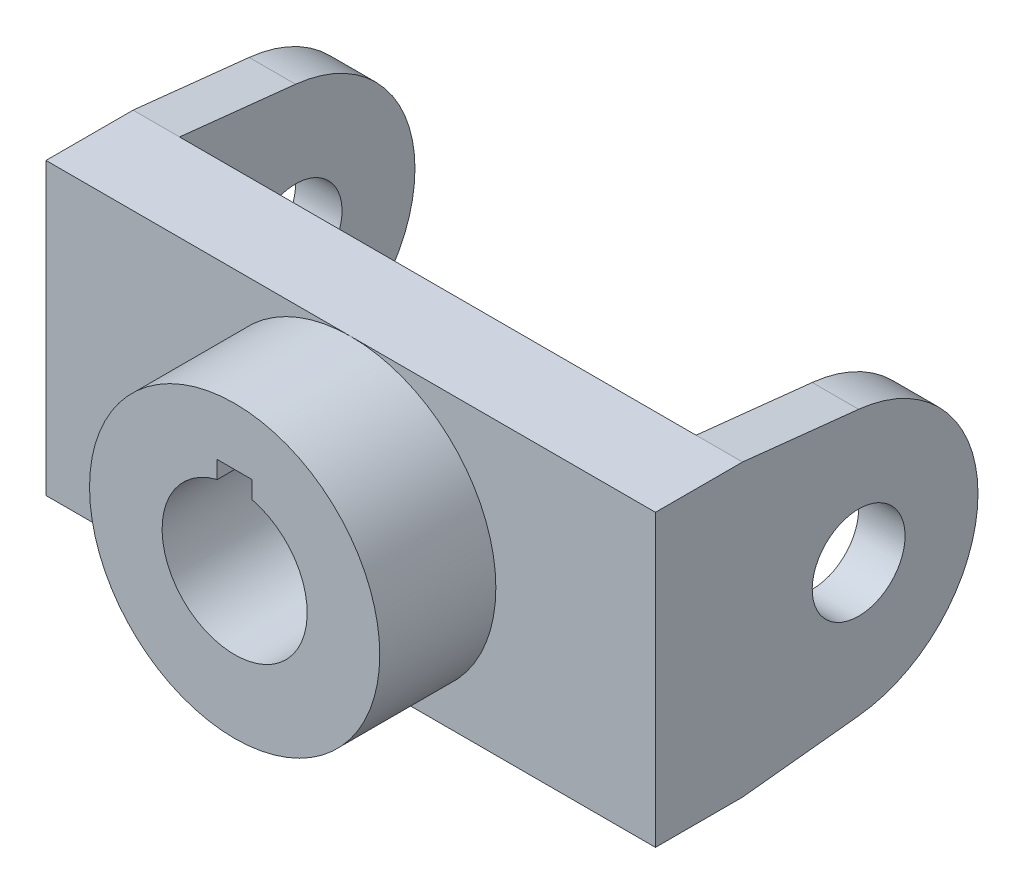
ISO-10303-21;
HEADER;
FILE_DESCRIPTION(('STEP AP214'),'2;1');
FILE_NAME('part.step','',(''),(''),'','','');
FILE_SCHEMA(('AUTOMOTIVE_DESIGN { 1 0 10303 214 1 1 1 1 }'));
ENDSEC;
DATA;
#1=APPLICATION_CONTEXT('core data for automotive mechanical design processes');
#2=APPLICATION_PROTOCOL_DEFINITION('international standard','automotive_design',2000,#1);
#3=PRODUCT_CONTEXT('',#1,'mechanical');
#4=PRODUCT('Part','Part','',(#3));
#5=PRODUCT_RELATED_PRODUCT_CATEGORY('part','',(#4));
#6=PRODUCT_DEFINITION_FORMATION('','',#4);
#7=PRODUCT_DEFINITION_CONTEXT('part definition',#1,'design');
#8=PRODUCT_DEFINITION('design','',#6,#7);
#9=PRODUCT_DEFINITION_SHAPE('','',#8);
#10=(LENGTH_UNIT() NAMED_UNIT(*) SI_UNIT(.MILLI.,.METRE.));
#11=(NAMED_UNIT(*) PLANE_ANGLE_UNIT() SI_UNIT($,.RADIAN.));
#12=(NAMED_UNIT(*) SI_UNIT($,.STERADIAN.) SOLID_ANGLE_UNIT());
#13=UNCERTAINTY_MEASURE_WITH_UNIT(LENGTH_MEASURE(1.E-05),#10,'distance_accuracy_value','');
#14=(GEOMETRIC_REPRESENTATION_CONTEXT(3) GLOBAL_UNCERTAINTY_ASSIGNED_CONTEXT((#13)) GLOBAL_UNIT_ASSIGNED_CONTEXT((#10,
#11,#12)) REPRESENTATION_CONTEXT('',''));
#15=CARTESIAN_POINT('',(0.,0.,0.));
#16=DIRECTION('',(0.,0.,1.));
#17=DIRECTION('',(1.,0.,0.));
#18=AXIS2_PLACEMENT_3D('',#15,#16,#17);
#19=CARTESIAN_POINT('',(0.,0.,15.));
#20=DIRECTION('',(0.,0.,1.));
#21=DIRECTION('',(1.,0.,0.));
#22=AXIS2_PLACEMENT_3D('',#19,#20,#21);
#23=PLANE('',#22);
#24=CARTESIAN_POINT('',(0.,0.,15.));
#25=DIRECTION('',(0.,0.,1.));
#26=DIRECTION('',(1.,0.,0.));
#27=AXIS2_PLACEMENT_3D('',#24,#25,#26);
#28=CIRCLE('',#27,25.);
#29=CARTESIAN_POINT('',(0.,25.,15.));
#30=VERTEX_POINT('',#29);
#31=CARTESIAN_POINT('',(0.,-25.,15.));
#32=VERTEX_POINT('',#31);
#33=EDGE_CURVE('E52',#30,#32,#28,.T.);
#34=ORIENTED_EDGE('',*,*,#33,.F.);
#35=DIRECTION('',(-1.,0.,0.));
#36=VECTOR('',#35,1.);
#37=CARTESIAN_POINT('',(-52.5,25.,15.));
#38=LINE('',#37,#36);
#39=CARTESIAN_POINT('',(-52.5,25.,15.));
#40=VERTEX_POINT('',#39);
#41=EDGE_CURVE('E302',#30,#40,#38,.T.);
#42=ORIENTED_EDGE('',*,*,#41,.T.);
#43=DIRECTION('',(0.,-1.,0.));
#44=VECTOR('',#43,1.);
#45=CARTESIAN_POINT('',(-52.5,25.,15.));
#46=LINE('',#45,#44);
#47=CARTESIAN_POINT('',(-52.5,-25.,15.));
#48=VERTEX_POINT('',#47);
#49=EDGE_CURVE('E307',#40,#48,#46,.T.);
#50=ORIENTED_EDGE('',*,*,#49,.T.);
#51=DIRECTION('',(1.,0.,0.));
#52=VECTOR('',#51,1.);
#53=CARTESIAN_POINT('',(-52.5,-25.,15.));
#54=LINE('',#53,#52);
#55=EDGE_CURVE('E311',#48,#32,#54,.T.);
#56=ORIENTED_EDGE('',*,*,#55,.T.);
#57=EDGE_LOOP('',(#34,#42,#50,#56));
#58=FACE_BOUND('',#57,.T.);
#59=ADVANCED_FACE('F41',(#58),#23,.T.);
#60=CARTESIAN_POINT('',(0.,0.,0.));
#61=DIRECTION('',(0.,0.,1.));
#62=DIRECTION('',(1.,0.,0.));
#63=AXIS2_PLACEMENT_3D('',#60,#61,#62);
#64=PLANE('',#63);
#65=DIRECTION('',(0.,-1.,0.));
#66=VECTOR('',#65,1.);
#67=CARTESIAN_POINT('',(44.5,0.,0.));
#68=LINE('',#67,#66);
#69=CARTESIAN_POINT('',(44.5,25.,0.));
#70=VERTEX_POINT('',#69);
#71=CARTESIAN_POINT('',(44.5,-25.,0.));
#72=VERTEX_POINT('',#71);
#73=EDGE_CURVE('E217',#70,#72,#68,.T.);
#74=ORIENTED_EDGE('',*,*,#73,.T.);
#75=DIRECTION('',(1.,0.,0.));
#76=VECTOR('',#75,1.);
#77=CARTESIAN_POINT('',(-52.5,-25.,0.));
#78=LINE('',#77,#76);
#79=CARTESIAN_POINT('',(-44.5,-25.,0.));
#80=VERTEX_POINT('',#79);
#81=EDGE_CURVE('E320',#80,#72,#78,.T.);
#82=ORIENTED_EDGE('',*,*,#81,.F.);
#83=DIRECTION('',(0.,-1.,0.));
#84=VECTOR('',#83,1.);
#85=CARTESIAN_POINT('',(-44.5,0.,0.));
#86=LINE('',#85,#84);
#87=CARTESIAN_POINT('',(-44.5,25.,0.));
#88=VERTEX_POINT('',#87);
#89=EDGE_CURVE('E270',#88,#80,#86,.T.);
#90=ORIENTED_EDGE('',*,*,#89,.F.);
#91=DIRECTION('',(-1.,0.,0.));
#92=VECTOR('',#91,1.);
#93=CARTESIAN_POINT('',(-52.5,25.,0.));
#94=LINE('',#93,#92);
#95=EDGE_CURVE('E292',#70,#88,#94,.T.);
#96=ORIENTED_EDGE('',*,*,#95,.F.);
#97=EDGE_LOOP('',(#74,#82,#90,#96));
#98=FACE_BOUND('',#97,.T.);
#99=ADVANCED_FACE('F357',(#98),#64,.F.);
#100=CARTESIAN_POINT('',(52.5,25.,15.));
#101=DIRECTION('',(-1.,0.,0.));
#102=DIRECTION('',(0.,0.,1.));
#103=AXIS2_PLACEMENT_3D('',#100,#101,#102);
#104=PLANE('',#103);
#105=DIRECTION('',(0.,0.,-1.));
#106=VECTOR('',#105,1.);
#107=CARTESIAN_POINT('',(52.5,-25.,15.));
#108=LINE('',#107,#106);
#109=CARTESIAN_POINT('',(52.5,-25.,15.));
#110=VERTEX_POINT('',#109);
#111=CARTESIAN_POINT('',(52.5,-25.,0.));
#112=VERTEX_POINT('',#111);
#113=EDGE_CURVE('E315',#110,#112,#108,.T.);
#114=ORIENTED_EDGE('',*,*,#113,.T.);
#115=DIRECTION('',(0.,0.105864041594176,-0.9943806135969));
#116=VECTOR('',#115,1.);
#117=CARTESIAN_POINT('',(52.5,-24.7198201174337,-2.63172876595661));
#118=LINE('',#117,#116);
#119=CARTESIAN_POINT('',(52.5,-22.8707541127287,-20.));
#120=VERTEX_POINT('',#119);
#121=EDGE_CURVE('E236',#112,#120,#118,.T.);
#122=ORIENTED_EDGE('',*,*,#121,.T.);
#123=CARTESIAN_POINT('',(52.5,0.,-17.565127043334));
#124=DIRECTION('',(-1.,0.,0.));
#125=DIRECTION('',(0.,-1.,0.));
#126=AXIS2_PLACEMENT_3D('',#123,#124,#125);
#127=CIRCLE('',#126,23.);
#128=CARTESIAN_POINT('',(52.5,22.8707541127287,-20.));
#129=VERTEX_POINT('',#128);
#130=EDGE_CURVE('E213',#129,#120,#127,.T.);
#131=ORIENTED_EDGE('',*,*,#130,.F.);
#132=DIRECTION('',(0.,-0.105864041594176,-0.9943806135969));
#133=VECTOR('',#132,1.);
#134=CARTESIAN_POINT('',(52.5,24.7198201174337,-2.63172876595661));
#135=LINE('',#134,#133);
#136=CARTESIAN_POINT('',(52.5,25.,0.));
#137=VERTEX_POINT('',#136);
#138=EDGE_CURVE('E232',#137,#129,#135,.T.);
#139=ORIENTED_EDGE('',*,*,#138,.F.);
#140=DIRECTION('',(0.,0.,-1.));
#141=VECTOR('',#140,1.);
#142=CARTESIAN_POINT('',(52.5,25.,15.));
#143=LINE('',#142,#141);
#144=CARTESIAN_POINT('',(52.5,25.,15.));
#145=VERTEX_POINT('',#144);
#146=EDGE_CURVE('E45',#145,#137,#143,.T.);
#147=ORIENTED_EDGE('',*,*,#146,.F.);
#148=DIRECTION('',(0.,1.,0.));
#149=VECTOR('',#148,1.);
#150=CARTESIAN_POINT('',(52.5,25.,15.));
#151=LINE('',#150,#149);
#152=EDGE_CURVE('E298',#110,#145,#151,.T.);
#153=ORIENTED_EDGE('',*,*,#152,.F.);
#154=EDGE_LOOP('',(#114,#122,#131,#139,#147,#153));
#155=FACE_BOUND('',#154,.T.);
#156=CARTESIAN_POINT('',(52.5,0.,-20.));
#157=DIRECTION('',(-1.,0.,0.));
#158=DIRECTION('',(0.,-1.,0.));
#159=AXIS2_PLACEMENT_3D('',#156,#157,#158);
#160=CIRCLE('',#159,8.);
#161=CARTESIAN_POINT('',(52.5,-7.99999999999999,-20.));
#162=VERTEX_POINT('',#161);
#163=EDGE_CURVE('E204',#162,#162,#160,.T.);
#164=ORIENTED_EDGE('',*,*,#163,.T.);
#165=EDGE_LOOP('',(#164));
#166=FACE_BOUND('',#165,.T.);
#167=ADVANCED_FACE('F43',(#155,#166),#104,.F.);
#168=CARTESIAN_POINT('',(-52.5,25.,15.));
#169=DIRECTION('',(0.,-1.,0.));
#170=DIRECTION('',(0.,0.,-1.));
#171=AXIS2_PLACEMENT_3D('',#168,#169,#170);
#172=PLANE('',#171);
#173=EDGE_CURVE('E316',#137,#70,#94,.T.);
#174=ORIENTED_EDGE('',*,*,#173,.T.);
#175=ORIENTED_EDGE('',*,*,#95,.T.);
#176=DIRECTION('',(-1.,0.,0.));
#177=VECTOR('',#176,1.);
#178=CARTESIAN_POINT('',(-44.5,25.,0.));
#179=LINE('',#178,#177);
#180=CARTESIAN_POINT('',(-52.5,25.,0.));
#181=VERTEX_POINT('',#180);
#182=EDGE_CURVE('E289',#88,#181,#179,.T.);
#183=ORIENTED_EDGE('',*,*,#182,.T.);
#184=DIRECTION('',(0.,0.,-1.));
#185=VECTOR('',#184,1.);
#186=CARTESIAN_POINT('',(-52.5,25.,15.));
#187=LINE('',#186,#185);
#188=EDGE_CURVE('E328',#40,#181,#187,.T.);
#189=ORIENTED_EDGE('',*,*,#188,.F.);
#190=ORIENTED_EDGE('',*,*,#41,.F.);
#191=EDGE_CURVE('E304',#145,#30,#38,.T.);
#192=ORIENTED_EDGE('',*,*,#191,.F.);
#193=ORIENTED_EDGE('',*,*,#146,.T.);
#194=EDGE_LOOP('',(#174,#175,#183,#189,#190,#192,#193));
#195=FACE_BOUND('',#194,.T.);
#196=ADVANCED_FACE('F339',(#195),#172,.F.);
#197=CARTESIAN_POINT('',(-52.5,25.,15.));
#198=DIRECTION('',(1.,0.,0.));
#199=DIRECTION('',(0.,1.,0.));
#200=AXIS2_PLACEMENT_3D('',#197,#198,#199);
#201=PLANE('',#200);
#202=ORIENTED_EDGE('',*,*,#188,.T.);
#203=DIRECTION('',(0.,-0.105864041594176,-0.9943806135969));
#204=VECTOR('',#203,1.);
#205=CARTESIAN_POINT('',(-52.5,24.7198201174337,-2.63172876595661));
#206=LINE('',#205,#204);
#207=CARTESIAN_POINT('',(-52.5,22.8707541127287,-20.));
#208=VERTEX_POINT('',#207);
#209=EDGE_CURVE('E278',#181,#208,#206,.T.);
#210=ORIENTED_EDGE('',*,*,#209,.T.);
#211=CARTESIAN_POINT('',(-52.5,0.,-17.565127043334));
#212=DIRECTION('',(-1.,0.,0.));
#213=DIRECTION('',(0.,-1.,0.));
#214=AXIS2_PLACEMENT_3D('',#211,#212,#213);
#215=CIRCLE('',#214,23.);
#216=CARTESIAN_POINT('',(-52.5,-22.8707541127287,-20.));
#217=VERTEX_POINT('',#216);
#218=EDGE_CURVE('E282',#208,#217,#215,.T.);
#219=ORIENTED_EDGE('',*,*,#218,.T.);
#220=DIRECTION('',(0.,0.105864041594176,-0.9943806135969));
#221=VECTOR('',#220,1.);
#222=CARTESIAN_POINT('',(-52.5,-24.7198201174337,-2.63172876595661));
#223=LINE('',#222,#221);
#224=CARTESIAN_POINT('',(-52.5,-25.,0.));
#225=VERTEX_POINT('',#224);
#226=EDGE_CURVE('E259',#225,#217,#223,.T.);
#227=ORIENTED_EDGE('',*,*,#226,.F.);
#228=DIRECTION('',(0.,0.,-1.));
#229=VECTOR('',#228,1.);
#230=CARTESIAN_POINT('',(-52.5,-25.,15.));
#231=LINE('',#230,#229);
#232=EDGE_CURVE('E326',#48,#225,#231,.T.);
#233=ORIENTED_EDGE('',*,*,#232,.F.);
#234=ORIENTED_EDGE('',*,*,#49,.F.);
#235=EDGE_LOOP('',(#202,#210,#219,#227,#233,#234));
#236=FACE_BOUND('',#235,.T.);
#237=CARTESIAN_POINT('',(-52.5,0.,-20.));
#238=DIRECTION('',(-1.,0.,0.));
#239=DIRECTION('',(0.,-1.,0.));
#240=AXIS2_PLACEMENT_3D('',#237,#238,#239);
#241=CIRCLE('',#240,8.);
#242=CARTESIAN_POINT('',(-52.5,-7.99999999999999,-20.));
#243=VERTEX_POINT('',#242);
#244=EDGE_CURVE('E247',#243,#243,#241,.T.);
#245=ORIENTED_EDGE('',*,*,#244,.F.);
#246=EDGE_LOOP('',(#245));
#247=FACE_BOUND('',#246,.T.);
#248=ADVANCED_FACE('F406',(#236,#247),#201,.F.);
#249=CARTESIAN_POINT('',(-52.5,-25.,15.));
#250=DIRECTION('',(0.,1.,0.));
#251=DIRECTION('',(0.,0.,1.));
#252=AXIS2_PLACEMENT_3D('',#249,#250,#251);
#253=PLANE('',#252);
#254=EDGE_CURVE('E303',#225,#80,#78,.T.);
#255=ORIENTED_EDGE('',*,*,#254,.T.);
#256=ORIENTED_EDGE('',*,*,#81,.T.);
#257=DIRECTION('',(1.,0.,0.));
#258=VECTOR('',#257,1.);
#259=CARTESIAN_POINT('',(44.5,-25.,0.));
#260=LINE('',#259,#258);
#261=EDGE_CURVE('E228',#72,#112,#260,.T.);
#262=ORIENTED_EDGE('',*,*,#261,.T.);
#263=ORIENTED_EDGE('',*,*,#113,.F.);
#264=EDGE_CURVE('E310',#32,#110,#54,.T.);
#265=ORIENTED_EDGE('',*,*,#264,.F.);
#266=ORIENTED_EDGE('',*,*,#55,.F.);
#267=ORIENTED_EDGE('',*,*,#232,.T.);
#268=EDGE_LOOP('',(#255,#256,#262,#263,#265,#266,#267));
#269=FACE_BOUND('',#268,.T.);
#270=ADVANCED_FACE('F367',(#269),#253,.F.);
#271=EDGE_CURVE('E11',#32,#30,#28,.T.);
#272=ORIENTED_EDGE('',*,*,#271,.F.);
#273=ORIENTED_EDGE('',*,*,#264,.T.);
#274=ORIENTED_EDGE('',*,*,#152,.T.);
#275=ORIENTED_EDGE('',*,*,#191,.T.);
#276=EDGE_LOOP('',(#272,#273,#274,#275));
#277=FACE_BOUND('',#276,.T.);
#278=ADVANCED_FACE('F364',(#277),#23,.T.);
#279=CARTESIAN_POINT('',(-44.5,24.7198201174337,-2.63172876595661));
#280=DIRECTION('',(0.,0.9943806135969,-0.105864041594176));
#281=DIRECTION('',(0.,0.105864041594176,0.9943806135969));
#282=AXIS2_PLACEMENT_3D('',#279,#280,#281);
#283=PLANE('',#282);
#284=ORIENTED_EDGE('',*,*,#209,.F.);
#285=ORIENTED_EDGE('',*,*,#182,.F.);
#286=DIRECTION('',(0.,-0.105864041594176,-0.9943806135969));
#287=VECTOR('',#286,1.);
#288=CARTESIAN_POINT('',(-44.5,24.7198201174337,-2.63172876595661));
#289=LINE('',#288,#287);
#290=CARTESIAN_POINT('',(-44.5,22.8707541127287,-20.));
#291=VERTEX_POINT('',#290);
#292=EDGE_CURVE('E258',#88,#291,#289,.T.);
#293=ORIENTED_EDGE('',*,*,#292,.T.);
#294=DIRECTION('',(-1.,0.,0.));
#295=VECTOR('',#294,1.);
#296=CARTESIAN_POINT('',(-44.5,22.8707541127287,-20.));
#297=LINE('',#296,#295);
#298=EDGE_CURVE('E274',#291,#208,#297,.T.);
#299=ORIENTED_EDGE('',*,*,#298,.T.);
#300=EDGE_LOOP('',(#284,#285,#293,#299));
#301=FACE_BOUND('',#300,.T.);
#302=ADVANCED_FACE('F398',(#301),#283,.T.);
#303=CARTESIAN_POINT('',(-44.5,-24.7198201174337,-2.63172876595661));
#304=DIRECTION('',(0.,0.9943806135969,0.105864041594176));
#305=DIRECTION('',(0.,-0.105864041594176,0.9943806135969));
#306=AXIS2_PLACEMENT_3D('',#303,#304,#305);
#307=PLANE('',#306);
#308=ORIENTED_EDGE('',*,*,#226,.T.);
#309=DIRECTION('',(-1.,0.,0.));
#310=VECTOR('',#309,1.);
#311=CARTESIAN_POINT('',(-44.5,-22.8707541127287,-20.));
#312=LINE('',#311,#310);
#313=CARTESIAN_POINT('',(-44.5,-22.8707541127287,-20.));
#314=VERTEX_POINT('',#313);
#315=EDGE_CURVE('E293',#314,#217,#312,.T.);
#316=ORIENTED_EDGE('',*,*,#315,.F.);
#317=DIRECTION('',(0.,0.105864041594176,-0.9943806135969));
#318=VECTOR('',#317,1.);
#319=CARTESIAN_POINT('',(-44.5,-24.7198201174337,-2.63172876595661));
#320=LINE('',#319,#318);
#321=EDGE_CURVE('E267',#80,#314,#320,.T.);
#322=ORIENTED_EDGE('',*,*,#321,.F.);
#323=ORIENTED_EDGE('',*,*,#254,.F.);
#324=EDGE_LOOP('',(#308,#316,#322,#323));
#325=FACE_BOUND('',#324,.T.);
#326=ADVANCED_FACE('F403',(#325),#307,.F.);
#327=CARTESIAN_POINT('',(-44.5,0.,-20.));
#328=DIRECTION('',(-1.,0.,0.));
#329=DIRECTION('',(0.,-1.,0.));
#330=AXIS2_PLACEMENT_3D('',#327,#328,#329);
#331=CYLINDRICAL_SURFACE('',#330,8.);
#332=CARTESIAN_POINT('',(-44.5,0.,-20.));
#333=DIRECTION('',(-1.,0.,0.));
#334=DIRECTION('',(0.,-1.,0.));
#335=AXIS2_PLACEMENT_3D('',#332,#333,#334);
#336=CIRCLE('',#335,8.);
#337=CARTESIAN_POINT('',(-44.5,-7.99999999999999,-20.));
#338=VERTEX_POINT('',#337);
#339=EDGE_CURVE('E254',#338,#338,#336,.T.);
#340=ORIENTED_EDGE('',*,*,#339,.F.);
#341=EDGE_LOOP('',(#340));
#342=FACE_BOUND('',#341,.T.);
#343=ORIENTED_EDGE('',*,*,#244,.T.);
#344=EDGE_LOOP('',(#343));
#345=FACE_BOUND('',#344,.T.);
#346=ADVANCED_FACE('F442',(#342,#345),#331,.F.);
#347=CARTESIAN_POINT('',(-44.5,0.,-17.565127043334));
#348=DIRECTION('',(-1.,0.,0.));
#349=DIRECTION('',(0.,-1.,0.));
#350=AXIS2_PLACEMENT_3D('',#347,#348,#349);
#351=CYLINDRICAL_SURFACE('',#350,23.);
#352=ORIENTED_EDGE('',*,*,#218,.F.);
#353=ORIENTED_EDGE('',*,*,#298,.F.);
#354=CARTESIAN_POINT('',(-44.5,0.,-17.565127043334));
#355=DIRECTION('',(-1.,0.,0.));
#356=DIRECTION('',(0.,-1.,0.));
#357=AXIS2_PLACEMENT_3D('',#354,#355,#356);
#358=CIRCLE('',#357,23.);
#359=EDGE_CURVE('E263',#291,#314,#358,.T.);
#360=ORIENTED_EDGE('',*,*,#359,.T.);
#361=ORIENTED_EDGE('',*,*,#315,.T.);
#362=EDGE_LOOP('',(#352,#353,#360,#361));
#363=FACE_BOUND('',#362,.T.);
#364=ADVANCED_FACE('F432',(#363),#351,.T.);
#365=CARTESIAN_POINT('',(-44.5,0.,0.));
#366=DIRECTION('',(-1.,0.,0.));
#367=DIRECTION('',(0.,-1.,0.));
#368=AXIS2_PLACEMENT_3D('',#365,#366,#367);
#369=PLANE('',#368);
#370=ORIENTED_EDGE('',*,*,#339,.T.);
#371=EDGE_LOOP('',(#370));
#372=FACE_BOUND('',#371,.T.);
#373=ORIENTED_EDGE('',*,*,#292,.F.);
#374=ORIENTED_EDGE('',*,*,#89,.T.);
#375=ORIENTED_EDGE('',*,*,#321,.T.);
#376=ORIENTED_EDGE('',*,*,#359,.F.);
#377=EDGE_LOOP('',(#373,#374,#375,#376));
#378=FACE_BOUND('',#377,.T.);
#379=ADVANCED_FACE('F381',(#372,#378),#369,.F.);
#380=CARTESIAN_POINT('',(44.5,24.7198201174337,-2.63172876595661));
#381=DIRECTION('',(0.,-0.9943806135969,0.105864041594176));
#382=DIRECTION('',(0.,-0.105864041594176,-0.9943806135969));
#383=AXIS2_PLACEMENT_3D('',#380,#381,#382);
#384=PLANE('',#383);
#385=ORIENTED_EDGE('',*,*,#138,.T.);
#386=DIRECTION('',(1.,0.,0.));
#387=VECTOR('',#386,1.);
#388=CARTESIAN_POINT('',(44.5,22.8707541127287,-20.));
#389=LINE('',#388,#387);
#390=CARTESIAN_POINT('',(44.5,22.8707541127287,-20.));
#391=VERTEX_POINT('',#390);
#392=EDGE_CURVE('E243',#391,#129,#389,.T.);
#393=ORIENTED_EDGE('',*,*,#392,.F.);
#394=DIRECTION('',(0.,-0.105864041594176,-0.9943806135969));
#395=VECTOR('',#394,1.);
#396=CARTESIAN_POINT('',(44.5,24.7198201174337,-2.63172876595661));
#397=LINE('',#396,#395);
#398=EDGE_CURVE('E212',#70,#391,#397,.T.);
#399=ORIENTED_EDGE('',*,*,#398,.F.);
#400=ORIENTED_EDGE('',*,*,#173,.F.);
#401=EDGE_LOOP('',(#385,#393,#399,#400));
#402=FACE_BOUND('',#401,.T.);
#403=ADVANCED_FACE('F347',(#402),#384,.F.);
#404=CARTESIAN_POINT('',(44.5,0.,-17.565127043334));
#405=DIRECTION('',(1.,0.,0.));
#406=DIRECTION('',(0.,1.,0.));
#407=AXIS2_PLACEMENT_3D('',#404,#405,#406);
#408=CYLINDRICAL_SURFACE('',#407,23.);
#409=ORIENTED_EDGE('',*,*,#130,.T.);
#410=DIRECTION('',(1.,0.,0.));
#411=VECTOR('',#410,1.);
#412=CARTESIAN_POINT('',(44.5,-22.8707541127287,-20.));
#413=LINE('',#412,#411);
#414=CARTESIAN_POINT('',(44.5,-22.8707541127287,-20.));
#415=VERTEX_POINT('',#414);
#416=EDGE_CURVE('E248',#415,#120,#413,.T.);
#417=ORIENTED_EDGE('',*,*,#416,.F.);
#418=CARTESIAN_POINT('',(44.5,0.,-17.565127043334));
#419=DIRECTION('',(-1.,0.,0.));
#420=DIRECTION('',(0.,-1.,0.));
#421=AXIS2_PLACEMENT_3D('',#418,#419,#420);
#422=CIRCLE('',#421,23.);
#423=EDGE_CURVE('E225',#391,#415,#422,.T.);
#424=ORIENTED_EDGE('',*,*,#423,.F.);
#425=ORIENTED_EDGE('',*,*,#392,.T.);
#426=EDGE_LOOP('',(#409,#417,#424,#425));
#427=FACE_BOUND('',#426,.T.);
#428=ADVANCED_FACE('F372',(#427),#408,.T.);
#429=CARTESIAN_POINT('',(44.5,-24.7198201174337,-2.63172876595661));
#430=DIRECTION('',(0.,-0.9943806135969,-0.105864041594176));
#431=DIRECTION('',(0.,0.105864041594176,-0.9943806135969));
#432=AXIS2_PLACEMENT_3D('',#429,#430,#431);
#433=PLANE('',#432);
#434=ORIENTED_EDGE('',*,*,#121,.F.);
#435=ORIENTED_EDGE('',*,*,#261,.F.);
#436=DIRECTION('',(0.,0.105864041594176,-0.9943806135969));
#437=VECTOR('',#436,1.);
#438=CARTESIAN_POINT('',(44.5,-24.7198201174337,-2.63172876595661));
#439=LINE('',#438,#437);
#440=EDGE_CURVE('E221',#72,#415,#439,.T.);
#441=ORIENTED_EDGE('',*,*,#440,.T.);
#442=ORIENTED_EDGE('',*,*,#416,.T.);
#443=EDGE_LOOP('',(#434,#435,#441,#442));
#444=FACE_BOUND('',#443,.T.);
#445=ADVANCED_FACE('F369',(#444),#433,.T.);
#446=CARTESIAN_POINT('',(44.5,0.,-20.));
#447=DIRECTION('',(1.,0.,0.));
#448=DIRECTION('',(0.,1.,0.));
#449=AXIS2_PLACEMENT_3D('',#446,#447,#448);
#450=CYLINDRICAL_SURFACE('',#449,8.);
#451=CARTESIAN_POINT('',(44.5,0.,-20.));
#452=DIRECTION('',(-1.,0.,0.));
#453=DIRECTION('',(0.,-1.,0.));
#454=AXIS2_PLACEMENT_3D('',#451,#452,#453);
#455=CIRCLE('',#454,8.);
#456=CARTESIAN_POINT('',(44.5,-7.99999999999999,-20.));
#457=VERTEX_POINT('',#456);
#458=EDGE_CURVE('E208',#457,#457,#455,.T.);
#459=ORIENTED_EDGE('',*,*,#458,.T.);
#460=EDGE_LOOP('',(#459));
#461=FACE_BOUND('',#460,.T.);
#462=ORIENTED_EDGE('',*,*,#163,.F.);
#463=EDGE_LOOP('',(#462));
#464=FACE_BOUND('',#463,.T.);
#465=ADVANCED_FACE('F379',(#461,#464),#450,.F.);
#466=CARTESIAN_POINT('',(44.5,0.,0.));
#467=DIRECTION('',(1.,0.,0.));
#468=DIRECTION('',(0.,-1.,0.));
#469=AXIS2_PLACEMENT_3D('',#466,#467,#468);
#470=PLANE('',#469);
#471=ORIENTED_EDGE('',*,*,#458,.F.);
#472=EDGE_LOOP('',(#471));
#473=FACE_BOUND('',#472,.T.);
#474=ORIENTED_EDGE('',*,*,#398,.T.);
#475=ORIENTED_EDGE('',*,*,#423,.T.);
#476=ORIENTED_EDGE('',*,*,#440,.F.);
#477=ORIENTED_EDGE('',*,*,#73,.F.);
#478=EDGE_LOOP('',(#474,#475,#476,#477));
#479=FACE_BOUND('',#478,.T.);
#480=ADVANCED_FACE('F352',(#473,#479),#470,.F.);
#481=CARTESIAN_POINT('',(0.,0.,35.));
#482=DIRECTION('',(0.,0.,1.));
#483=DIRECTION('',(1.,0.,0.));
#484=AXIS2_PLACEMENT_3D('',#481,#482,#483);
#485=PLANE('',#484);
#486=CARTESIAN_POINT('',(0.,0.,35.));
#487=DIRECTION('',(0.,0.,1.));
#488=DIRECTION('',(1.,0.,0.));
#489=AXIS2_PLACEMENT_3D('',#486,#487,#488);
#490=CIRCLE('',#489,25.);
#491=CARTESIAN_POINT('',(25.,0.,35.));
#492=VERTEX_POINT('',#491);
#493=EDGE_CURVE('E201',#492,#492,#490,.T.);
#494=ORIENTED_EDGE('',*,*,#493,.T.);
#495=EDGE_LOOP('',(#494));
#496=FACE_BOUND('',#495,.T.);
#497=DIRECTION('',(0.,1.,0.));
#498=VECTOR('',#497,1.);
#499=CARTESIAN_POINT('',(3.,12.1346610995116,35.));
#500=LINE('',#499,#498);
#501=CARTESIAN_POINT('',(3.,12.1346610995116,35.));
#502=VERTEX_POINT('',#501);
#503=CARTESIAN_POINT('',(3.,15.1346610995116,35.));
#504=VERTEX_POINT('',#503);
#505=EDGE_CURVE('E159',#502,#504,#500,.T.);
#506=ORIENTED_EDGE('',*,*,#505,.F.);
#507=CARTESIAN_POINT('',(0.,0.,35.));
#508=DIRECTION('',(0.,0.,1.));
#509=DIRECTION('',(1.,0.,0.));
#510=AXIS2_PLACEMENT_3D('',#507,#508,#509);
#511=CIRCLE('',#510,12.5);
#512=CARTESIAN_POINT('',(-3.,12.1346610995116,35.));
#513=VERTEX_POINT('',#512);
#514=EDGE_CURVE('E150',#513,#502,#511,.T.);
#515=ORIENTED_EDGE('',*,*,#514,.F.);
#516=DIRECTION('',(0.,-1.,0.));
#517=VECTOR('',#516,1.);
#518=CARTESIAN_POINT('',(-3.,12.1346610995116,35.));
#519=LINE('',#518,#517);
#520=CARTESIAN_POINT('',(-3.,15.1346610995116,35.));
#521=VERTEX_POINT('',#520);
#522=EDGE_CURVE('E177',#521,#513,#519,.T.);
#523=ORIENTED_EDGE('',*,*,#522,.F.);
#524=DIRECTION('',(-1.,0.,0.));
#525=VECTOR('',#524,1.);
#526=CARTESIAN_POINT('',(3.,15.1346610995116,35.));
#527=LINE('',#526,#525);
#528=EDGE_CURVE('E173',#504,#521,#527,.T.);
#529=ORIENTED_EDGE('',*,*,#528,.F.);
#530=EDGE_LOOP('',(#506,#515,#523,#529));
#531=FACE_BOUND('',#530,.T.);
#532=ADVANCED_FACE('F171',(#496,#531),#485,.T.);
#533=CARTESIAN_POINT('',(0.,0.,35.));
#534=DIRECTION('',(0.,0.,-1.));
#535=DIRECTION('',(-1.,0.,0.));
#536=AXIS2_PLACEMENT_3D('',#533,#534,#535);
#537=CYLINDRICAL_SURFACE('',#536,25.);
#538=ORIENTED_EDGE('',*,*,#493,.F.);
#539=EDGE_LOOP('',(#538));
#540=FACE_BOUND('',#539,.T.);
#541=ORIENTED_EDGE('',*,*,#33,.T.);
#542=ORIENTED_EDGE('',*,*,#271,.T.);
#543=EDGE_LOOP('',(#541,#542));
#544=FACE_BOUND('',#543,.T.);
#545=ADVANCED_FACE('F541',(#540,#544),#537,.T.);
#546=CARTESIAN_POINT('',(0.,0.,35.));
#547=DIRECTION('',(0.,0.,-1.));
#548=DIRECTION('',(-1.,0.,0.));
#549=AXIS2_PLACEMENT_3D('',#546,#547,#548);
#550=CYLINDRICAL_SURFACE('',#549,12.5);
#551=CARTESIAN_POINT('',(0.,0.,15.));
#552=DIRECTION('',(0.,0.,1.));
#553=DIRECTION('',(1.,0.,0.));
#554=AXIS2_PLACEMENT_3D('',#551,#552,#553);
#555=CIRCLE('',#554,12.5);
#556=CARTESIAN_POINT('',(-3.,12.1346610995116,15.));
#557=VERTEX_POINT('',#556);
#558=CARTESIAN_POINT('',(3.,12.1346610995116,15.));
#559=VERTEX_POINT('',#558);
#560=EDGE_CURVE('E182',#557,#559,#555,.T.);
#561=ORIENTED_EDGE('',*,*,#560,.F.);
#562=DIRECTION('',(0.,0.,-1.));
#563=VECTOR('',#562,1.);
#564=CARTESIAN_POINT('',(-3.,12.1346610995116,35.));
#565=LINE('',#564,#563);
#566=EDGE_CURVE('E59',#513,#557,#565,.T.);
#567=ORIENTED_EDGE('',*,*,#566,.F.);
#568=ORIENTED_EDGE('',*,*,#514,.T.);
#569=DIRECTION('',(0.,0.,-1.));
#570=VECTOR('',#569,1.);
#571=CARTESIAN_POINT('',(3.,12.1346610995116,35.));
#572=LINE('',#571,#570);
#573=EDGE_CURVE('E153',#502,#559,#572,.T.);
#574=ORIENTED_EDGE('',*,*,#573,.T.);
#575=EDGE_LOOP('',(#561,#567,#568,#574));
#576=FACE_BOUND('',#575,.T.);
#577=ADVANCED_FACE('F152',(#576),#550,.F.);
#578=CARTESIAN_POINT('',(3.,12.1346610995116,35.));
#579=DIRECTION('',(-1.,0.,0.));
#580=DIRECTION('',(0.,0.,1.));
#581=AXIS2_PLACEMENT_3D('',#578,#579,#580);
#582=PLANE('',#581);
#583=DIRECTION('',(0.,1.,0.));
#584=VECTOR('',#583,1.);
#585=CARTESIAN_POINT('',(3.,12.1346610995116,15.));
#586=LINE('',#585,#584);
#587=CARTESIAN_POINT('',(3.,15.1346610995116,15.));
#588=VERTEX_POINT('',#587);
#589=EDGE_CURVE('E166',#559,#588,#586,.T.);
#590=ORIENTED_EDGE('',*,*,#589,.F.);
#591=ORIENTED_EDGE('',*,*,#573,.F.);
#592=ORIENTED_EDGE('',*,*,#505,.T.);
#593=DIRECTION('',(0.,0.,-1.));
#594=VECTOR('',#593,1.);
#595=CARTESIAN_POINT('',(3.,15.1346610995116,35.));
#596=LINE('',#595,#594);
#597=EDGE_CURVE('E168',#504,#588,#596,.T.);
#598=ORIENTED_EDGE('',*,*,#597,.T.);
#599=EDGE_LOOP('',(#590,#591,#592,#598));
#600=FACE_BOUND('',#599,.T.);
#601=ADVANCED_FACE('F163',(#600),#582,.T.);
#602=CARTESIAN_POINT('',(3.,15.1346610995116,35.));
#603=DIRECTION('',(0.,-1.,0.));
#604=DIRECTION('',(0.,0.,-1.));
#605=AXIS2_PLACEMENT_3D('',#602,#603,#604);
#606=PLANE('',#605);
#607=DIRECTION('',(-1.,0.,0.));
#608=VECTOR('',#607,1.);
#609=CARTESIAN_POINT('',(3.,15.1346610995116,15.));
#610=LINE('',#609,#608);
#611=CARTESIAN_POINT('',(-3.,15.1346610995116,15.));
#612=VERTEX_POINT('',#611);
#613=EDGE_CURVE('E187',#588,#612,#610,.T.);
#614=ORIENTED_EDGE('',*,*,#613,.F.);
#615=ORIENTED_EDGE('',*,*,#597,.F.);
#616=ORIENTED_EDGE('',*,*,#528,.T.);
#617=DIRECTION('',(0.,0.,-1.));
#618=VECTOR('',#617,1.);
#619=CARTESIAN_POINT('',(-3.,15.1346610995116,35.));
#620=LINE('',#619,#618);
#621=EDGE_CURVE('E196',#521,#612,#620,.T.);
#622=ORIENTED_EDGE('',*,*,#621,.T.);
#623=EDGE_LOOP('',(#614,#615,#616,#622));
#624=FACE_BOUND('',#623,.T.);
#625=ADVANCED_FACE('F561',(#624),#606,.T.);
#626=CARTESIAN_POINT('',(-3.,12.1346610995116,35.));
#627=DIRECTION('',(1.,0.,0.));
#628=DIRECTION('',(0.,0.,-1.));
#629=AXIS2_PLACEMENT_3D('',#626,#627,#628);
#630=PLANE('',#629);
#631=DIRECTION('',(0.,-1.,0.));
#632=VECTOR('',#631,1.);
#633=CARTESIAN_POINT('',(-3.,12.1346610995116,15.));
#634=LINE('',#633,#632);
#635=EDGE_CURVE('E160',#612,#557,#634,.T.);
#636=ORIENTED_EDGE('',*,*,#635,.F.);
#637=ORIENTED_EDGE('',*,*,#621,.F.);
#638=ORIENTED_EDGE('',*,*,#522,.T.);
#639=ORIENTED_EDGE('',*,*,#566,.T.);
#640=EDGE_LOOP('',(#636,#637,#638,#639));
#641=FACE_BOUND('',#640,.T.);
#642=ADVANCED_FACE('F395',(#641),#630,.T.);
#643=ORIENTED_EDGE('',*,*,#635,.T.);
#644=ORIENTED_EDGE('',*,*,#560,.T.);
#645=ORIENTED_EDGE('',*,*,#589,.T.);
#646=ORIENTED_EDGE('',*,*,#613,.T.);
#647=EDGE_LOOP('',(#643,#644,#645,#646));
#648=FACE_BOUND('',#647,.T.);
#649=ADVANCED_FACE('F387',(#648),#23,.T.);
#650=CLOSED_SHELL('',(#59,#99,#167,#196,#248,#270,#278,#302,#326,#346,#364,#379,#403,#428,#445,
#465,#480,#532,#545,#577,#601,#625,#642,#649));
#651=MANIFOLD_SOLID_BREP('B2',#650);
#652=ADVANCED_BREP_SHAPE_REPRESENTATION('',(#18,#651),#14);
#653=SHAPE_DEFINITION_REPRESENTATION(#9,#652);
ENDSEC;
END-ISO-10303-21;
